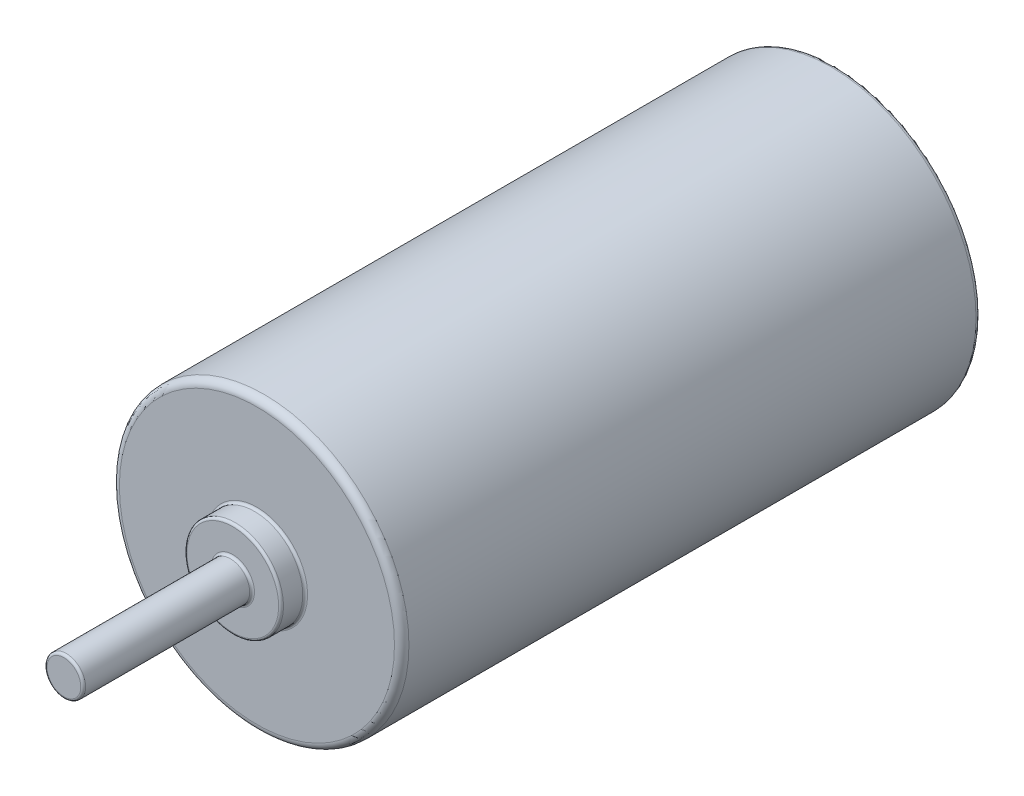
ISO-10303-21;
HEADER;
FILE_DESCRIPTION(('STEP AP214'),'2;1');
FILE_NAME('part.step','',(''),(''),'','','');
FILE_SCHEMA(('AUTOMOTIVE_DESIGN { 1 0 10303 214 1 1 1 1 }'));
ENDSEC;
DATA;
#1=APPLICATION_CONTEXT('core data for automotive mechanical design processes');
#2=APPLICATION_PROTOCOL_DEFINITION('international standard','automotive_design',2000,#1);
#3=PRODUCT_CONTEXT('',#1,'mechanical');
#4=PRODUCT('Part','Part','',(#3));
#5=PRODUCT_RELATED_PRODUCT_CATEGORY('part','',(#4));
#6=PRODUCT_DEFINITION_FORMATION('','',#4);
#7=PRODUCT_DEFINITION_CONTEXT('part definition',#1,'design');
#8=PRODUCT_DEFINITION('design','',#6,#7);
#9=PRODUCT_DEFINITION_SHAPE('','',#8);
#10=(LENGTH_UNIT() NAMED_UNIT(*) SI_UNIT(.MILLI.,.METRE.));
#11=(NAMED_UNIT(*) PLANE_ANGLE_UNIT() SI_UNIT($,.RADIAN.));
#12=(NAMED_UNIT(*) SI_UNIT($,.STERADIAN.) SOLID_ANGLE_UNIT());
#13=UNCERTAINTY_MEASURE_WITH_UNIT(LENGTH_MEASURE(1.E-05),#10,'distance_accuracy_value','');
#14=(GEOMETRIC_REPRESENTATION_CONTEXT(3) GLOBAL_UNCERTAINTY_ASSIGNED_CONTEXT((#13)) GLOBAL_UNIT_ASSIGNED_CONTEXT((#10,
#11,#12)) REPRESENTATION_CONTEXT('',''));
#15=CARTESIAN_POINT('',(0.,0.,0.));
#16=DIRECTION('',(0.,0.,1.));
#17=DIRECTION('',(1.,0.,0.));
#18=AXIS2_PLACEMENT_3D('',#15,#16,#17);
#19=CARTESIAN_POINT('',(0.,3.,0.));
#20=DIRECTION('',(0.,0.,-1.));
#21=DIRECTION('',(-1.,0.,0.));
#22=AXIS2_PLACEMENT_3D('',#19,#20,#21);
#23=PLANE('',#22);
#24=CARTESIAN_POINT('',(0.,0.,0.));
#25=DIRECTION('',(0.,0.,-1.));
#26=DIRECTION('',(-1.,0.,0.));
#27=AXIS2_PLACEMENT_3D('',#24,#25,#26);
#28=CIRCLE('',#27,2.85);
#29=CARTESIAN_POINT('',(-2.85,0.,0.));
#30=VERTEX_POINT('',#29);
#31=EDGE_CURVE('E49',#30,#30,#28,.F.);
#32=ORIENTED_EDGE('',*,*,#31,.T.);
#33=EDGE_LOOP('',(#32));
#34=FACE_BOUND('',#33,.T.);
#35=CARTESIAN_POINT('',(0.,0.,0.));
#36=DIRECTION('',(0.,0.,-1.));
#37=DIRECTION('',(-1.,0.,0.));
#38=AXIS2_PLACEMENT_3D('',#35,#36,#37);
#39=CIRCLE('',#38,1.05);
#40=CARTESIAN_POINT('',(-1.05,0.,0.));
#41=VERTEX_POINT('',#40);
#42=EDGE_CURVE('E69',#41,#41,#39,.T.);
#43=ORIENTED_EDGE('',*,*,#42,.T.);
#44=EDGE_LOOP('',(#43));
#45=FACE_BOUND('',#44,.T.);
#46=ADVANCED_FACE('F34',(#34,#45),#23,.F.);
#47=CARTESIAN_POINT('',(0.,0.,94.8303325897492));
#48=DIRECTION('',(0.,0.,1.));
#49=DIRECTION('',(1.,0.,0.));
#50=AXIS2_PLACEMENT_3D('',#47,#48,#49);
#51=CYLINDRICAL_SURFACE('',#50,3.);
#52=CARTESIAN_POINT('',(0.,0.,-11.9));
#53=DIRECTION('',(0.,0.,1.));
#54=DIRECTION('',(1.,0.,0.));
#55=AXIS2_PLACEMENT_3D('',#52,#53,#54);
#56=CIRCLE('',#55,3.);
#57=CARTESIAN_POINT('',(3.,0.,-11.9));
#58=VERTEX_POINT('',#57);
#59=EDGE_CURVE('E41',#58,#58,#56,.T.);
#60=ORIENTED_EDGE('',*,*,#59,.T.);
#61=EDGE_LOOP('',(#60));
#62=FACE_BOUND('',#61,.T.);
#63=CARTESIAN_POINT('',(0.,0.,-0.149999999999997));
#64=DIRECTION('',(0.,0.,-1.));
#65=DIRECTION('',(-1.,0.,0.));
#66=AXIS2_PLACEMENT_3D('',#63,#64,#65);
#67=CIRCLE('',#66,3.);
#68=CARTESIAN_POINT('',(-3.,0.,-0.149999999999997));
#69=VERTEX_POINT('',#68);
#70=EDGE_CURVE('E45',#69,#69,#67,.T.);
#71=ORIENTED_EDGE('',*,*,#70,.T.);
#72=EDGE_LOOP('',(#71));
#73=FACE_BOUND('',#72,.T.);
#74=ADVANCED_FACE('F120',(#62,#73),#51,.T.);
#75=CARTESIAN_POINT('',(0.,3.,-12.));
#76=DIRECTION('',(0.,0.,1.));
#77=DIRECTION('',(1.,0.,0.));
#78=AXIS2_PLACEMENT_3D('',#75,#76,#77);
#79=PLANE('',#78);
#80=CARTESIAN_POINT('',(0.,0.,-12.));
#81=DIRECTION('',(0.,0.,1.));
#82=DIRECTION('',(1.,0.,0.));
#83=AXIS2_PLACEMENT_3D('',#80,#81,#82);
#84=CIRCLE('',#83,2.9);
#85=CARTESIAN_POINT('',(2.9,0.,-12.));
#86=VERTEX_POINT('',#85);
#87=EDGE_CURVE('E10',#86,#86,#84,.F.);
#88=ORIENTED_EDGE('',*,*,#87,.T.);
#89=EDGE_LOOP('',(#88));
#90=FACE_BOUND('',#89,.T.);
#91=ADVANCED_FACE('F115',(#90),#79,.F.);
#92=CARTESIAN_POINT('',(0.,0.4,4.));
#93=DIRECTION('',(0.,0.,-1.));
#94=DIRECTION('',(-1.,0.,0.));
#95=AXIS2_PLACEMENT_3D('',#92,#93,#94);
#96=PLANE('',#95);
#97=CARTESIAN_POINT('',(0.,0.,4.));
#98=DIRECTION('',(0.,0.,-1.));
#99=DIRECTION('',(-1.,0.,0.));
#100=AXIS2_PLACEMENT_3D('',#97,#98,#99);
#101=CIRCLE('',#100,0.35);
#102=CARTESIAN_POINT('',(-0.35,0.,4.));
#103=VERTEX_POINT('',#102);
#104=EDGE_CURVE('E54',#103,#103,#101,.F.);
#105=ORIENTED_EDGE('',*,*,#104,.T.);
#106=EDGE_LOOP('',(#105));
#107=FACE_BOUND('',#106,.T.);
#108=ADVANCED_FACE('F104',(#107),#96,.F.);
#109=CARTESIAN_POINT('',(0.,0.,94.8303325897492));
#110=DIRECTION('',(0.,0.,1.));
#111=DIRECTION('',(1.,0.,0.));
#112=AXIS2_PLACEMENT_3D('',#109,#110,#111);
#113=CYLINDRICAL_SURFACE('',#112,0.4);
#114=CARTESIAN_POINT('',(0.,0.,0.549999999999995));
#115=DIRECTION('',(0.,0.,-1.));
#116=DIRECTION('',(-1.,0.,0.));
#117=AXIS2_PLACEMENT_3D('',#114,#115,#116);
#118=CIRCLE('',#117,0.4);
#119=CARTESIAN_POINT('',(-0.4,0.,0.549999999999995));
#120=VERTEX_POINT('',#119);
#121=EDGE_CURVE('E57',#120,#120,#118,.F.);
#122=ORIENTED_EDGE('',*,*,#121,.T.);
#123=EDGE_LOOP('',(#122));
#124=FACE_BOUND('',#123,.T.);
#125=CARTESIAN_POINT('',(0.,0.,3.95));
#126=DIRECTION('',(0.,0.,-1.));
#127=DIRECTION('',(-1.,0.,0.));
#128=AXIS2_PLACEMENT_3D('',#125,#126,#127);
#129=CIRCLE('',#128,0.4);
#130=CARTESIAN_POINT('',(-0.4,0.,3.95));
#131=VERTEX_POINT('',#130);
#132=EDGE_CURVE('E60',#131,#131,#129,.T.);
#133=ORIENTED_EDGE('',*,*,#132,.T.);
#134=EDGE_LOOP('',(#133));
#135=FACE_BOUND('',#134,.T.);
#136=ADVANCED_FACE('F92',(#124,#135),#113,.T.);
#137=CARTESIAN_POINT('',(0.,1.,0.5));
#138=DIRECTION('',(0.,0.,-1.));
#139=DIRECTION('',(-1.,0.,0.));
#140=AXIS2_PLACEMENT_3D('',#137,#138,#139);
#141=PLANE('',#140);
#142=CARTESIAN_POINT('',(0.,0.,0.5));
#143=DIRECTION('',(0.,0.,-1.));
#144=DIRECTION('',(-1.,0.,0.));
#145=AXIS2_PLACEMENT_3D('',#142,#143,#144);
#146=CIRCLE('',#145,0.95);
#147=CARTESIAN_POINT('',(-0.95,0.,0.5));
#148=VERTEX_POINT('',#147);
#149=EDGE_CURVE('E63',#148,#148,#146,.F.);
#150=ORIENTED_EDGE('',*,*,#149,.T.);
#151=EDGE_LOOP('',(#150));
#152=FACE_BOUND('',#151,.T.);
#153=CARTESIAN_POINT('',(0.,0.,0.5));
#154=DIRECTION('',(0.,0.,-1.));
#155=DIRECTION('',(-1.,0.,0.));
#156=AXIS2_PLACEMENT_3D('',#153,#154,#155);
#157=CIRCLE('',#156,0.45);
#158=CARTESIAN_POINT('',(-0.45,0.,0.5));
#159=VERTEX_POINT('',#158);
#160=EDGE_CURVE('E66',#159,#159,#157,.T.);
#161=ORIENTED_EDGE('',*,*,#160,.T.);
#162=EDGE_LOOP('',(#161));
#163=FACE_BOUND('',#162,.T.);
#164=ADVANCED_FACE('F89',(#152,#163),#141,.F.);
#165=CARTESIAN_POINT('',(0.,0.,94.8303325897492));
#166=DIRECTION('',(0.,0.,1.));
#167=DIRECTION('',(1.,0.,0.));
#168=AXIS2_PLACEMENT_3D('',#165,#166,#167);
#169=CYLINDRICAL_SURFACE('',#168,1.);
#170=CARTESIAN_POINT('',(0.,0.,0.0499999999999945));
#171=DIRECTION('',(0.,0.,-1.));
#172=DIRECTION('',(-1.,0.,0.));
#173=AXIS2_PLACEMENT_3D('',#170,#171,#172);
#174=CIRCLE('',#173,1.);
#175=CARTESIAN_POINT('',(-1.,0.,0.0499999999999945));
#176=VERTEX_POINT('',#175);
#177=EDGE_CURVE('E72',#176,#176,#174,.F.);
#178=ORIENTED_EDGE('',*,*,#177,.T.);
#179=EDGE_LOOP('',(#178));
#180=FACE_BOUND('',#179,.T.);
#181=CARTESIAN_POINT('',(0.,0.,0.450000000000006));
#182=DIRECTION('',(0.,0.,-1.));
#183=DIRECTION('',(-1.,0.,0.));
#184=AXIS2_PLACEMENT_3D('',#181,#182,#183);
#185=CIRCLE('',#184,1.);
#186=CARTESIAN_POINT('',(-1.,0.,0.450000000000006));
#187=VERTEX_POINT('',#186);
#188=EDGE_CURVE('E75',#187,#187,#185,.T.);
#189=ORIENTED_EDGE('',*,*,#188,.T.);
#190=EDGE_LOOP('',(#189));
#191=FACE_BOUND('',#190,.T.);
#192=ADVANCED_FACE('F79',(#180,#191),#169,.T.);
#193=CARTESIAN_POINT('',(0.,0.,0.0499999999999945));
#194=DIRECTION('',(0.,0.,-1.));
#195=DIRECTION('',(-1.,0.,0.));
#196=AXIS2_PLACEMENT_3D('',#193,#194,#195);
#197=TOROIDAL_SURFACE('',#196,1.05,0.05);
#198=ORIENTED_EDGE('',*,*,#42,.F.);
#199=EDGE_LOOP('',(#198));
#200=FACE_BOUND('',#199,.T.);
#201=ORIENTED_EDGE('',*,*,#177,.F.);
#202=EDGE_LOOP('',(#201));
#203=FACE_BOUND('',#202,.T.);
#204=ADVANCED_FACE('F85',(#200,#203),#197,.F.);
#205=CARTESIAN_POINT('',(0.,0.,0.450000000000006));
#206=DIRECTION('',(0.,0.,-1.));
#207=DIRECTION('',(-1.,0.,0.));
#208=AXIS2_PLACEMENT_3D('',#205,#206,#207);
#209=TOROIDAL_SURFACE('',#208,0.95,0.05);
#210=ORIENTED_EDGE('',*,*,#188,.F.);
#211=EDGE_LOOP('',(#210));
#212=FACE_BOUND('',#211,.T.);
#213=ORIENTED_EDGE('',*,*,#149,.F.);
#214=EDGE_LOOP('',(#213));
#215=FACE_BOUND('',#214,.T.);
#216=ADVANCED_FACE('F81',(#212,#215),#209,.T.);
#217=CARTESIAN_POINT('',(0.,0.,0.549999999999995));
#218=DIRECTION('',(0.,0.,-1.));
#219=DIRECTION('',(-1.,0.,0.));
#220=AXIS2_PLACEMENT_3D('',#217,#218,#219);
#221=TOROIDAL_SURFACE('',#220,0.45,0.05);
#222=ORIENTED_EDGE('',*,*,#160,.F.);
#223=EDGE_LOOP('',(#222));
#224=FACE_BOUND('',#223,.T.);
#225=ORIENTED_EDGE('',*,*,#121,.F.);
#226=EDGE_LOOP('',(#225));
#227=FACE_BOUND('',#226,.T.);
#228=ADVANCED_FACE('F84',(#224,#227),#221,.F.);
#229=CARTESIAN_POINT('',(0.,0.,3.95));
#230=DIRECTION('',(0.,0.,-1.));
#231=DIRECTION('',(-1.,0.,0.));
#232=AXIS2_PLACEMENT_3D('',#229,#230,#231);
#233=TOROIDAL_SURFACE('',#232,0.35,0.05);
#234=ORIENTED_EDGE('',*,*,#132,.F.);
#235=EDGE_LOOP('',(#234));
#236=FACE_BOUND('',#235,.T.);
#237=ORIENTED_EDGE('',*,*,#104,.F.);
#238=EDGE_LOOP('',(#237));
#239=FACE_BOUND('',#238,.T.);
#240=ADVANCED_FACE('F98',(#236,#239),#233,.T.);
#241=CARTESIAN_POINT('',(0.,0.,-0.149999999999997));
#242=DIRECTION('',(0.,0.,-1.));
#243=DIRECTION('',(-1.,0.,0.));
#244=AXIS2_PLACEMENT_3D('',#241,#242,#243);
#245=TOROIDAL_SURFACE('',#244,2.85,0.15);
#246=ORIENTED_EDGE('',*,*,#70,.F.);
#247=EDGE_LOOP('',(#246));
#248=FACE_BOUND('',#247,.T.);
#249=ORIENTED_EDGE('',*,*,#31,.F.);
#250=EDGE_LOOP('',(#249));
#251=FACE_BOUND('',#250,.T.);
#252=ADVANCED_FACE('F110',(#248,#251),#245,.T.);
#253=CARTESIAN_POINT('',(0.,0.,-11.9));
#254=DIRECTION('',(0.,0.,1.));
#255=DIRECTION('',(1.,0.,0.));
#256=AXIS2_PLACEMENT_3D('',#253,#254,#255);
#257=TOROIDAL_SURFACE('',#256,2.9,0.1);
#258=ORIENTED_EDGE('',*,*,#87,.F.);
#259=EDGE_LOOP('',(#258));
#260=FACE_BOUND('',#259,.T.);
#261=ORIENTED_EDGE('',*,*,#59,.F.);
#262=EDGE_LOOP('',(#261));
#263=FACE_BOUND('',#262,.T.);
#264=ADVANCED_FACE('F36',(#260,#263),#257,.T.);
#265=CLOSED_SHELL('',(#46,#74,#91,#108,#136,#164,#192,#204,#216,#228,#240,#252,#264));
#266=MANIFOLD_SOLID_BREP('B2',#265);
#267=ADVANCED_BREP_SHAPE_REPRESENTATION('',(#18,#266),#14);
#268=SHAPE_DEFINITION_REPRESENTATION(#9,#267);
ENDSEC;
END-ISO-10303-21;
